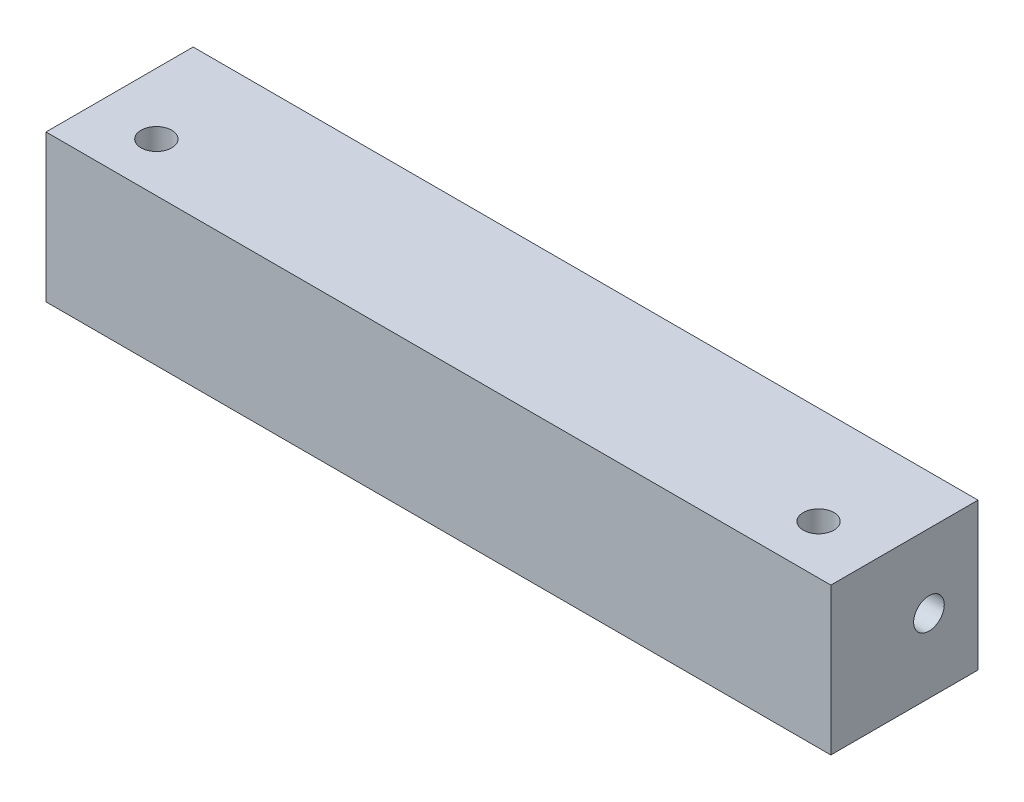
ISO-10303-21;
HEADER;
FILE_DESCRIPTION(('STEP AP214'),'2;1');
FILE_NAME('part.step','',(''),(''),'','','');
FILE_SCHEMA(('AUTOMOTIVE_DESIGN { 1 0 10303 214 1 1 1 1 }'));
ENDSEC;
DATA;
#1=APPLICATION_CONTEXT('core data for automotive mechanical design processes');
#2=APPLICATION_PROTOCOL_DEFINITION('international standard','automotive_design',2000,#1);
#3=PRODUCT_CONTEXT('',#1,'mechanical');
#4=PRODUCT('Part','Part','',(#3));
#5=PRODUCT_RELATED_PRODUCT_CATEGORY('part','',(#4));
#6=PRODUCT_DEFINITION_FORMATION('','',#4);
#7=PRODUCT_DEFINITION_CONTEXT('part definition',#1,'design');
#8=PRODUCT_DEFINITION('design','',#6,#7);
#9=PRODUCT_DEFINITION_SHAPE('','',#8);
#10=(LENGTH_UNIT() NAMED_UNIT(*) SI_UNIT(.MILLI.,.METRE.));
#11=(NAMED_UNIT(*) PLANE_ANGLE_UNIT() SI_UNIT($,.RADIAN.));
#12=(NAMED_UNIT(*) SI_UNIT($,.STERADIAN.) SOLID_ANGLE_UNIT());
#13=UNCERTAINTY_MEASURE_WITH_UNIT(LENGTH_MEASURE(1.E-05),#10,'distance_accuracy_value','');
#14=(GEOMETRIC_REPRESENTATION_CONTEXT(3) GLOBAL_UNCERTAINTY_ASSIGNED_CONTEXT((#13)) GLOBAL_UNIT_ASSIGNED_CONTEXT((#10,
#11,#12)) REPRESENTATION_CONTEXT('',''));
#15=CARTESIAN_POINT('',(0.,0.,0.));
#16=DIRECTION('',(0.,0.,1.));
#17=DIRECTION('',(1.,0.,0.));
#18=AXIS2_PLACEMENT_3D('',#15,#16,#17);
#19=CARTESIAN_POINT('',(32.,0.,6.));
#20=DIRECTION('',(-1.,0.,0.));
#21=DIRECTION('',(0.,0.,1.));
#22=AXIS2_PLACEMENT_3D('',#19,#20,#21);
#23=PLANE('',#22);
#24=CARTESIAN_POINT('',(32.,3.,2.));
#25=DIRECTION('',(1.,0.,0.));
#26=DIRECTION('',(0.,0.,-1.));
#27=AXIS2_PLACEMENT_3D('',#24,#25,#26);
#28=CIRCLE('',#27,0.625);
#29=CARTESIAN_POINT('',(32.,3.,1.375));
#30=VERTEX_POINT('',#29);
#31=EDGE_CURVE('E128',#30,#30,#28,.T.);
#32=ORIENTED_EDGE('',*,*,#31,.F.);
#33=EDGE_LOOP('',(#32));
#34=FACE_BOUND('',#33,.T.);
#35=DIRECTION('',(0.,1.,0.));
#36=VECTOR('',#35,1.);
#37=CARTESIAN_POINT('',(32.,0.,0.));
#38=LINE('',#37,#36);
#39=CARTESIAN_POINT('',(32.,0.,0.));
#40=VERTEX_POINT('',#39);
#41=CARTESIAN_POINT('',(32.,6.,0.));
#42=VERTEX_POINT('',#41);
#43=EDGE_CURVE('E107',#40,#42,#38,.T.);
#44=ORIENTED_EDGE('',*,*,#43,.T.);
#45=DIRECTION('',(0.,0.,-1.));
#46=VECTOR('',#45,1.);
#47=CARTESIAN_POINT('',(32.,6.,6.));
#48=LINE('',#47,#46);
#49=CARTESIAN_POINT('',(32.,6.,6.));
#50=VERTEX_POINT('',#49);
#51=EDGE_CURVE('E11',#50,#42,#48,.T.);
#52=ORIENTED_EDGE('',*,*,#51,.F.);
#53=DIRECTION('',(0.,1.,0.));
#54=VECTOR('',#53,1.);
#55=CARTESIAN_POINT('',(32.,0.,6.));
#56=LINE('',#55,#54);
#57=CARTESIAN_POINT('',(32.,0.,6.));
#58=VERTEX_POINT('',#57);
#59=EDGE_CURVE('E91',#58,#50,#56,.T.);
#60=ORIENTED_EDGE('',*,*,#59,.F.);
#61=DIRECTION('',(0.,0.,-1.));
#62=VECTOR('',#61,1.);
#63=CARTESIAN_POINT('',(32.,0.,6.));
#64=LINE('',#63,#62);
#65=EDGE_CURVE('E103',#58,#40,#64,.T.);
#66=ORIENTED_EDGE('',*,*,#65,.T.);
#67=EDGE_LOOP('',(#44,#52,#60,#66));
#68=FACE_BOUND('',#67,.T.);
#69=ADVANCED_FACE('F39',(#34,#68),#23,.F.);
#70=CARTESIAN_POINT('',(32.,6.,6.));
#71=DIRECTION('',(0.,-1.,0.));
#72=DIRECTION('',(1.,0.,0.));
#73=AXIS2_PLACEMENT_3D('',#70,#71,#72);
#74=PLANE('',#73);
#75=CARTESIAN_POINT('',(29.5,6.,4.));
#76=DIRECTION('',(0.,1.,0.));
#77=DIRECTION('',(-1.,0.,0.));
#78=AXIS2_PLACEMENT_3D('',#75,#76,#77);
#79=CIRCLE('',#78,0.624999999999999);
#80=CARTESIAN_POINT('',(28.875,6.,4.));
#81=VERTEX_POINT('',#80);
#82=EDGE_CURVE('E144',#81,#81,#79,.T.);
#83=ORIENTED_EDGE('',*,*,#82,.F.);
#84=EDGE_LOOP('',(#83));
#85=FACE_BOUND('',#84,.T.);
#86=CARTESIAN_POINT('',(2.5,6.00000000000001,4.));
#87=DIRECTION('',(0.,1.,0.));
#88=DIRECTION('',(-1.,0.,0.));
#89=AXIS2_PLACEMENT_3D('',#86,#87,#88);
#90=CIRCLE('',#89,0.625);
#91=CARTESIAN_POINT('',(1.875,6.00000000000001,4.));
#92=VERTEX_POINT('',#91);
#93=EDGE_CURVE('E136',#92,#92,#90,.T.);
#94=ORIENTED_EDGE('',*,*,#93,.F.);
#95=EDGE_LOOP('',(#94));
#96=FACE_BOUND('',#95,.T.);
#97=DIRECTION('',(-1.,0.,0.));
#98=VECTOR('',#97,1.);
#99=CARTESIAN_POINT('',(32.,6.,0.));
#100=LINE('',#99,#98);
#101=CARTESIAN_POINT('',(0.,6.00000000000001,0.));
#102=VERTEX_POINT('',#101);
#103=EDGE_CURVE('E96',#42,#102,#100,.T.);
#104=ORIENTED_EDGE('',*,*,#103,.T.);
#105=DIRECTION('',(0.,0.,-1.));
#106=VECTOR('',#105,1.);
#107=CARTESIAN_POINT('',(0.,6.00000000000001,6.));
#108=LINE('',#107,#106);
#109=CARTESIAN_POINT('',(0.,6.00000000000001,6.));
#110=VERTEX_POINT('',#109);
#111=EDGE_CURVE('E48',#110,#102,#108,.T.);
#112=ORIENTED_EDGE('',*,*,#111,.F.);
#113=DIRECTION('',(-1.,0.,0.));
#114=VECTOR('',#113,1.);
#115=CARTESIAN_POINT('',(32.,6.,6.));
#116=LINE('',#115,#114);
#117=EDGE_CURVE('E86',#50,#110,#116,.T.);
#118=ORIENTED_EDGE('',*,*,#117,.F.);
#119=ORIENTED_EDGE('',*,*,#51,.T.);
#120=EDGE_LOOP('',(#104,#112,#118,#119));
#121=FACE_BOUND('',#120,.T.);
#122=ADVANCED_FACE('F95',(#85,#96,#121),#74,.F.);
#123=CARTESIAN_POINT('',(0.,0.,6.));
#124=DIRECTION('',(1.,0.,0.));
#125=DIRECTION('',(0.,1.,0.));
#126=AXIS2_PLACEMENT_3D('',#123,#124,#125);
#127=PLANE('',#126);
#128=CARTESIAN_POINT('',(0.,3.,2.));
#129=DIRECTION('',(1.,0.,0.));
#130=DIRECTION('',(0.,0.,-1.));
#131=AXIS2_PLACEMENT_3D('',#128,#129,#130);
#132=CIRCLE('',#131,0.625);
#133=CARTESIAN_POINT('',(0.,3.,1.375));
#134=VERTEX_POINT('',#133);
#135=EDGE_CURVE('E111',#134,#134,#132,.T.);
#136=ORIENTED_EDGE('',*,*,#135,.T.);
#137=EDGE_LOOP('',(#136));
#138=FACE_BOUND('',#137,.T.);
#139=DIRECTION('',(0.,-1.,0.));
#140=VECTOR('',#139,1.);
#141=CARTESIAN_POINT('',(0.,0.,0.));
#142=LINE('',#141,#140);
#143=CARTESIAN_POINT('',(0.,0.,0.));
#144=VERTEX_POINT('',#143);
#145=EDGE_CURVE('E73',#102,#144,#142,.T.);
#146=ORIENTED_EDGE('',*,*,#145,.T.);
#147=DIRECTION('',(0.,0.,-1.));
#148=VECTOR('',#147,1.);
#149=CARTESIAN_POINT('',(0.,0.,6.));
#150=LINE('',#149,#148);
#151=CARTESIAN_POINT('',(0.,0.,6.));
#152=VERTEX_POINT('',#151);
#153=EDGE_CURVE('E98',#152,#144,#150,.T.);
#154=ORIENTED_EDGE('',*,*,#153,.F.);
#155=DIRECTION('',(0.,-1.,0.));
#156=VECTOR('',#155,1.);
#157=CARTESIAN_POINT('',(0.,0.,6.));
#158=LINE('',#157,#156);
#159=EDGE_CURVE('E89',#110,#152,#158,.T.);
#160=ORIENTED_EDGE('',*,*,#159,.F.);
#161=ORIENTED_EDGE('',*,*,#111,.T.);
#162=EDGE_LOOP('',(#146,#154,#160,#161));
#163=FACE_BOUND('',#162,.T.);
#164=ADVANCED_FACE('F99',(#138,#163),#127,.F.);
#165=CARTESIAN_POINT('',(32.,0.,6.));
#166=DIRECTION('',(0.,1.,0.));
#167=DIRECTION('',(-1.,0.,0.));
#168=AXIS2_PLACEMENT_3D('',#165,#166,#167);
#169=PLANE('',#168);
#170=CARTESIAN_POINT('',(29.5,0.,4.));
#171=DIRECTION('',(0.,1.,0.));
#172=DIRECTION('',(-1.,0.,0.));
#173=AXIS2_PLACEMENT_3D('',#170,#171,#172);
#174=CIRCLE('',#173,0.624999999999999);
#175=CARTESIAN_POINT('',(28.875,0.,4.));
#176=VERTEX_POINT('',#175);
#177=EDGE_CURVE('E132',#176,#176,#174,.T.);
#178=ORIENTED_EDGE('',*,*,#177,.T.);
#179=EDGE_LOOP('',(#178));
#180=FACE_BOUND('',#179,.T.);
#181=CARTESIAN_POINT('',(2.5,0.,4.));
#182=DIRECTION('',(0.,1.,0.));
#183=DIRECTION('',(-1.,0.,0.));
#184=AXIS2_PLACEMENT_3D('',#181,#182,#183);
#185=CIRCLE('',#184,0.625);
#186=CARTESIAN_POINT('',(1.875,0.,4.));
#187=VERTEX_POINT('',#186);
#188=EDGE_CURVE('E140',#187,#187,#185,.T.);
#189=ORIENTED_EDGE('',*,*,#188,.T.);
#190=EDGE_LOOP('',(#189));
#191=FACE_BOUND('',#190,.T.);
#192=DIRECTION('',(1.,0.,0.));
#193=VECTOR('',#192,1.);
#194=CARTESIAN_POINT('',(32.,0.,0.));
#195=LINE('',#194,#193);
#196=EDGE_CURVE('E79',#144,#40,#195,.T.);
#197=ORIENTED_EDGE('',*,*,#196,.T.);
#198=ORIENTED_EDGE('',*,*,#65,.F.);
#199=DIRECTION('',(1.,0.,0.));
#200=VECTOR('',#199,1.);
#201=CARTESIAN_POINT('',(32.,0.,6.));
#202=LINE('',#201,#200);
#203=EDGE_CURVE('E56',#152,#58,#202,.T.);
#204=ORIENTED_EDGE('',*,*,#203,.F.);
#205=ORIENTED_EDGE('',*,*,#153,.T.);
#206=EDGE_LOOP('',(#197,#198,#204,#205));
#207=FACE_BOUND('',#206,.T.);
#208=ADVANCED_FACE('F121',(#180,#191,#207),#169,.F.);
#209=CARTESIAN_POINT('',(0.,0.,6.));
#210=DIRECTION('',(0.,0.,1.));
#211=DIRECTION('',(1.,0.,0.));
#212=AXIS2_PLACEMENT_3D('',#209,#210,#211);
#213=PLANE('',#212);
#214=ORIENTED_EDGE('',*,*,#59,.T.);
#215=ORIENTED_EDGE('',*,*,#117,.T.);
#216=ORIENTED_EDGE('',*,*,#159,.T.);
#217=ORIENTED_EDGE('',*,*,#203,.T.);
#218=EDGE_LOOP('',(#214,#215,#216,#217));
#219=FACE_BOUND('',#218,.T.);
#220=ADVANCED_FACE('F87',(#219),#213,.T.);
#221=CARTESIAN_POINT('',(0.,0.,0.));
#222=DIRECTION('',(0.,0.,1.));
#223=DIRECTION('',(1.,0.,0.));
#224=AXIS2_PLACEMENT_3D('',#221,#222,#223);
#225=PLANE('',#224);
#226=ORIENTED_EDGE('',*,*,#43,.F.);
#227=ORIENTED_EDGE('',*,*,#196,.F.);
#228=ORIENTED_EDGE('',*,*,#145,.F.);
#229=ORIENTED_EDGE('',*,*,#103,.F.);
#230=EDGE_LOOP('',(#226,#227,#228,#229));
#231=FACE_BOUND('',#230,.T.);
#232=ADVANCED_FACE('F124',(#231),#225,.F.);
#233=CARTESIAN_POINT('',(0.,3.,2.));
#234=DIRECTION('',(1.,0.,0.));
#235=DIRECTION('',(0.,0.,-1.));
#236=AXIS2_PLACEMENT_3D('',#233,#234,#235);
#237=CYLINDRICAL_SURFACE('',#236,0.625);
#238=ORIENTED_EDGE('',*,*,#135,.F.);
#239=EDGE_LOOP('',(#238));
#240=FACE_BOUND('',#239,.T.);
#241=ORIENTED_EDGE('',*,*,#31,.T.);
#242=EDGE_LOOP('',(#241));
#243=FACE_BOUND('',#242,.T.);
#244=ADVANCED_FACE('F166',(#240,#243),#237,.F.);
#245=CARTESIAN_POINT('',(2.5,0.,4.));
#246=DIRECTION('',(0.,1.,0.));
#247=DIRECTION('',(-1.,0.,0.));
#248=AXIS2_PLACEMENT_3D('',#245,#246,#247);
#249=CYLINDRICAL_SURFACE('',#248,0.625);
#250=ORIENTED_EDGE('',*,*,#188,.F.);
#251=EDGE_LOOP('',(#250));
#252=FACE_BOUND('',#251,.T.);
#253=ORIENTED_EDGE('',*,*,#93,.T.);
#254=EDGE_LOOP('',(#253));
#255=FACE_BOUND('',#254,.T.);
#256=ADVANCED_FACE('F157',(#252,#255),#249,.F.);
#257=CARTESIAN_POINT('',(29.5,0.,4.));
#258=DIRECTION('',(0.,1.,0.));
#259=DIRECTION('',(-1.,0.,0.));
#260=AXIS2_PLACEMENT_3D('',#257,#258,#259);
#261=CYLINDRICAL_SURFACE('',#260,0.624999999999999);
#262=ORIENTED_EDGE('',*,*,#177,.F.);
#263=EDGE_LOOP('',(#262));
#264=FACE_BOUND('',#263,.T.);
#265=ORIENTED_EDGE('',*,*,#82,.T.);
#266=EDGE_LOOP('',(#265));
#267=FACE_BOUND('',#266,.T.);
#268=ADVANCED_FACE('F154',(#264,#267),#261,.F.);
#269=CLOSED_SHELL('',(#69,#122,#164,#208,#220,#232,#244,#256,#268));
#270=MANIFOLD_SOLID_BREP('B2',#269);
#271=ADVANCED_BREP_SHAPE_REPRESENTATION('',(#18,#270),#14);
#272=SHAPE_DEFINITION_REPRESENTATION(#9,#271);
ENDSEC;
END-ISO-10303-21;
